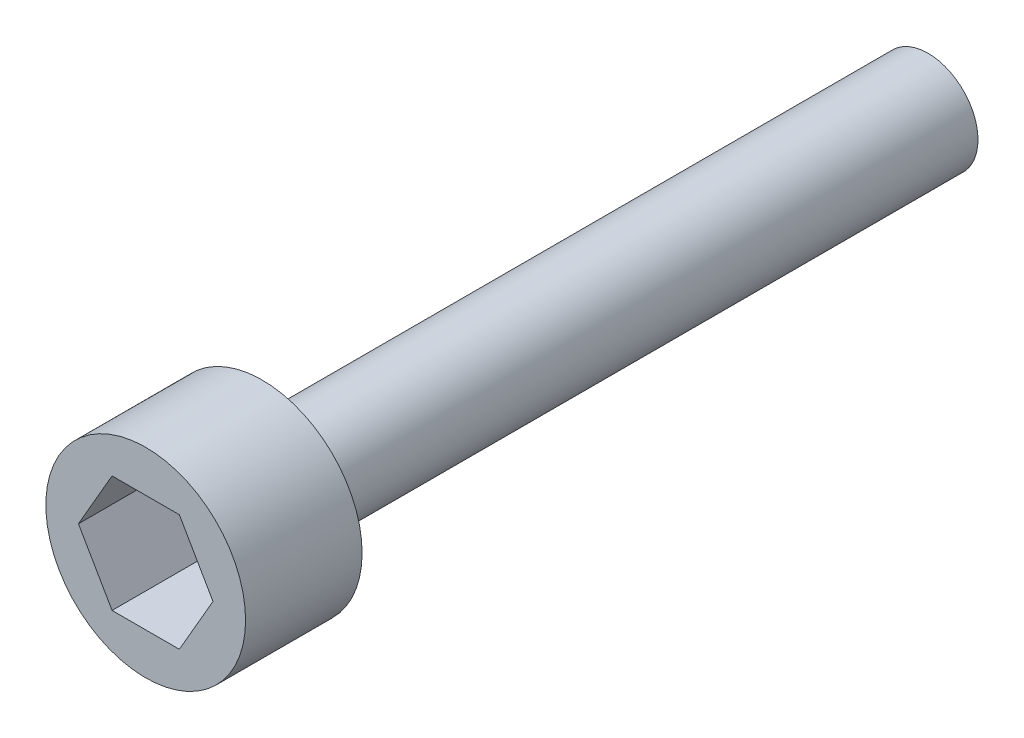
ISO-10303-21;
HEADER;
FILE_DESCRIPTION(('STEP AP214'),'2;1');
FILE_NAME('part.step','',(''),(''),'','','');
FILE_SCHEMA(('AUTOMOTIVE_DESIGN { 1 0 10303 214 1 1 1 1 }'));
ENDSEC;
DATA;
#1=APPLICATION_CONTEXT('core data for automotive mechanical design processes');
#2=APPLICATION_PROTOCOL_DEFINITION('international standard','automotive_design',2000,#1);
#3=PRODUCT_CONTEXT('',#1,'mechanical');
#4=PRODUCT('Part','Part','',(#3));
#5=PRODUCT_RELATED_PRODUCT_CATEGORY('part','',(#4));
#6=PRODUCT_DEFINITION_FORMATION('','',#4);
#7=PRODUCT_DEFINITION_CONTEXT('part definition',#1,'design');
#8=PRODUCT_DEFINITION('design','',#6,#7);
#9=PRODUCT_DEFINITION_SHAPE('','',#8);
#10=(LENGTH_UNIT() NAMED_UNIT(*) SI_UNIT(.MILLI.,.METRE.));
#11=(NAMED_UNIT(*) PLANE_ANGLE_UNIT() SI_UNIT($,.RADIAN.));
#12=(NAMED_UNIT(*) SI_UNIT($,.STERADIAN.) SOLID_ANGLE_UNIT());
#13=UNCERTAINTY_MEASURE_WITH_UNIT(LENGTH_MEASURE(1.E-05),#10,'distance_accuracy_value','');
#14=(GEOMETRIC_REPRESENTATION_CONTEXT(3) GLOBAL_UNCERTAINTY_ASSIGNED_CONTEXT((#13)) GLOBAL_UNIT_ASSIGNED_CONTEXT((#10,
#11,#12)) REPRESENTATION_CONTEXT('',''));
#15=CARTESIAN_POINT('',(0.,0.,0.));
#16=DIRECTION('',(0.,0.,1.));
#17=DIRECTION('',(1.,0.,0.));
#18=AXIS2_PLACEMENT_3D('',#15,#16,#17);
#19=CARTESIAN_POINT('',(0.,0.,3.5));
#20=DIRECTION('',(0.,0.,-1.));
#21=DIRECTION('',(-1.,0.,0.));
#22=AXIS2_PLACEMENT_3D('',#19,#20,#21);
#23=CYLINDRICAL_SURFACE('',#22,3.);
#24=CARTESIAN_POINT('',(0.,0.,3.5));
#25=DIRECTION('',(0.,0.,1.));
#26=DIRECTION('',(1.,0.,0.));
#27=AXIS2_PLACEMENT_3D('',#24,#25,#26);
#28=CIRCLE('',#27,3.);
#29=CARTESIAN_POINT('',(3.,0.,3.5));
#30=VERTEX_POINT('',#29);
#31=EDGE_CURVE('E11',#30,#30,#28,.T.);
#32=ORIENTED_EDGE('',*,*,#31,.F.);
#33=EDGE_LOOP('',(#32));
#34=FACE_BOUND('',#33,.T.);
#35=CARTESIAN_POINT('',(0.,0.,0.));
#36=DIRECTION('',(0.,0.,1.));
#37=DIRECTION('',(1.,0.,0.));
#38=AXIS2_PLACEMENT_3D('',#35,#36,#37);
#39=CIRCLE('',#38,3.);
#40=CARTESIAN_POINT('',(3.,0.,0.));
#41=VERTEX_POINT('',#40);
#42=EDGE_CURVE('E38',#41,#41,#39,.T.);
#43=ORIENTED_EDGE('',*,*,#42,.T.);
#44=EDGE_LOOP('',(#43));
#45=FACE_BOUND('',#44,.T.);
#46=ADVANCED_FACE('F35',(#34,#45),#23,.T.);
#47=CARTESIAN_POINT('',(0.,0.,3.5));
#48=DIRECTION('',(0.,0.,1.));
#49=DIRECTION('',(1.,0.,0.));
#50=AXIS2_PLACEMENT_3D('',#47,#48,#49);
#51=PLANE('',#50);
#52=DIRECTION('',(-0.499999999999528,-0.866025403784711,0.));
#53=VECTOR('',#52,1.);
#54=CARTESIAN_POINT('',(-2.02072594216261,2.1557411053031E-12,3.5));
#55=LINE('',#54,#53);
#56=CARTESIAN_POINT('',(-1.01036297108294,1.75000000000058,3.5));
#57=VERTEX_POINT('',#56);
#58=CARTESIAN_POINT('',(-2.02072594216261,2.15561075933568E-12,3.5));
#59=VERTEX_POINT('',#58);
#60=EDGE_CURVE('E49',#57,#59,#55,.T.);
#61=ORIENTED_EDGE('',*,*,#60,.F.);
#62=DIRECTION('',(-1.,-7.11024037944377E-13,0.));
#63=VECTOR('',#62,1.);
#64=CARTESIAN_POINT('',(-1.01036297108294,1.75000000000058,3.5));
#65=LINE('',#64,#63);
#66=CARTESIAN_POINT('',(1.01036297108301,1.75000000000202,3.5));
#67=VERTEX_POINT('',#66);
#68=EDGE_CURVE('E133',#67,#57,#65,.T.);
#69=ORIENTED_EDGE('',*,*,#68,.F.);
#70=DIRECTION('',(-0.50000000000043,0.86602540378419,0.));
#71=VECTOR('',#70,1.);
#72=CARTESIAN_POINT('',(1.01036297108301,1.75000000000202,3.5));
#73=LINE('',#72,#71);
#74=CARTESIAN_POINT('',(2.02072594216593,2.15574110530311E-12,3.5));
#75=VERTEX_POINT('',#74);
#76=EDGE_CURVE('E131',#75,#67,#73,.T.);
#77=ORIENTED_EDGE('',*,*,#76,.F.);
#78=DIRECTION('',(0.499999999999527,0.866025403784711,0.));
#79=VECTOR('',#78,1.);
#80=CARTESIAN_POINT('',(2.02072594216593,2.15574110530311E-12,3.5));
#81=LINE('',#80,#79);
#82=CARTESIAN_POINT('',(1.01036297108301,-1.75000000000192,3.5));
#83=VERTEX_POINT('',#82);
#84=EDGE_CURVE('E97',#83,#75,#81,.T.);
#85=ORIENTED_EDGE('',*,*,#84,.F.);
#86=DIRECTION('',(1.,7.11024037946673E-13,0.));
#87=VECTOR('',#86,1.);
#88=CARTESIAN_POINT('',(1.01036297108301,-1.75000000000192,3.5));
#89=LINE('',#88,#87);
#90=CARTESIAN_POINT('',(-1.01036297107642,-1.75000000000336,3.5));
#91=VERTEX_POINT('',#90);
#92=EDGE_CURVE('E127',#91,#83,#89,.T.);
#93=ORIENTED_EDGE('',*,*,#92,.F.);
#94=DIRECTION('',(0.500000000000431,-0.86602540378419,0.));
#95=VECTOR('',#94,1.);
#96=CARTESIAN_POINT('',(-1.01036297107642,-1.75000000000336,3.5));
#97=LINE('',#96,#95);
#98=EDGE_CURVE('E123',#59,#91,#97,.T.);
#99=ORIENTED_EDGE('',*,*,#98,.F.);
#100=EDGE_LOOP('',(#61,#69,#77,#85,#93,#99));
#101=FACE_BOUND('',#100,.T.);
#102=ORIENTED_EDGE('',*,*,#31,.T.);
#103=EDGE_LOOP('',(#102));
#104=FACE_BOUND('',#103,.T.);
#105=ADVANCED_FACE('F146',(#101,#104),#51,.T.);
#106=CARTESIAN_POINT('',(0.,0.,0.));
#107=DIRECTION('',(0.,0.,1.));
#108=DIRECTION('',(1.,0.,0.));
#109=AXIS2_PLACEMENT_3D('',#106,#107,#108);
#110=PLANE('',#109);
#111=CARTESIAN_POINT('',(0.,0.,0.));
#112=DIRECTION('',(0.,0.,1.));
#113=DIRECTION('',(1.,0.,0.));
#114=AXIS2_PLACEMENT_3D('',#111,#112,#113);
#115=CIRCLE('',#114,1.5);
#116=CARTESIAN_POINT('',(1.5,0.,0.));
#117=VERTEX_POINT('',#116);
#118=EDGE_CURVE('E153',#117,#117,#115,.T.);
#119=ORIENTED_EDGE('',*,*,#118,.T.);
#120=EDGE_LOOP('',(#119));
#121=FACE_BOUND('',#120,.T.);
#122=ORIENTED_EDGE('',*,*,#42,.F.);
#123=EDGE_LOOP('',(#122));
#124=FACE_BOUND('',#123,.T.);
#125=ADVANCED_FACE('F174',(#121,#124),#110,.F.);
#126=CARTESIAN_POINT('',(-2.02072594216261,2.1557411053031E-12,0.7));
#127=DIRECTION('',(-0.866025403784711,0.499999999999528,0.));
#128=DIRECTION('',(-0.499999999999528,-0.866025403784711,0.));
#129=AXIS2_PLACEMENT_3D('',#126,#127,#128);
#130=PLANE('',#129);
#131=ORIENTED_EDGE('',*,*,#60,.T.);
#132=DIRECTION('',(0.,0.,1.));
#133=VECTOR('',#132,1.);
#134=CARTESIAN_POINT('',(-2.02072594216261,2.1557411053031E-12,0.7));
#135=LINE('',#134,#133);
#136=CARTESIAN_POINT('',(-2.02072594216261,2.1557411053031E-12,0.7));
#137=VERTEX_POINT('',#136);
#138=EDGE_CURVE('E79',#137,#59,#135,.T.);
#139=ORIENTED_EDGE('',*,*,#138,.F.);
#140=DIRECTION('',(-0.499999999999528,-0.866025403784711,0.));
#141=VECTOR('',#140,1.);
#142=CARTESIAN_POINT('',(-2.02072594216261,2.1557411053031E-12,0.7));
#143=LINE('',#142,#141);
#144=CARTESIAN_POINT('',(-1.01036297108294,1.75000000000058,0.7));
#145=VERTEX_POINT('',#144);
#146=EDGE_CURVE('E135',#145,#137,#143,.T.);
#147=ORIENTED_EDGE('',*,*,#146,.F.);
#148=DIRECTION('',(0.,0.,1.));
#149=VECTOR('',#148,1.);
#150=CARTESIAN_POINT('',(-1.01036297108294,1.75000000000058,0.7));
#151=LINE('',#150,#149);
#152=EDGE_CURVE('E57',#145,#57,#151,.T.);
#153=ORIENTED_EDGE('',*,*,#152,.T.);
#154=EDGE_LOOP('',(#131,#139,#147,#153));
#155=FACE_BOUND('',#154,.T.);
#156=ADVANCED_FACE('F182',(#155),#130,.F.);
#157=CARTESIAN_POINT('',(-1.01036297108294,1.75000000000058,0.7));
#158=DIRECTION('',(-7.11024037944377E-13,1.,0.));
#159=DIRECTION('',(-1.,-7.11024037944377E-13,0.));
#160=AXIS2_PLACEMENT_3D('',#157,#158,#159);
#161=PLANE('',#160);
#162=ORIENTED_EDGE('',*,*,#68,.T.);
#163=ORIENTED_EDGE('',*,*,#152,.F.);
#164=DIRECTION('',(-1.,-7.11024037944377E-13,0.));
#165=VECTOR('',#164,1.);
#166=CARTESIAN_POINT('',(-1.01036297108294,1.75000000000058,0.7));
#167=LINE('',#166,#165);
#168=CARTESIAN_POINT('',(1.01036297108301,1.75000000000202,0.7));
#169=VERTEX_POINT('',#168);
#170=EDGE_CURVE('E109',#169,#145,#167,.T.);
#171=ORIENTED_EDGE('',*,*,#170,.F.);
#172=DIRECTION('',(0.,0.,1.));
#173=VECTOR('',#172,1.);
#174=CARTESIAN_POINT('',(1.01036297108301,1.75000000000202,0.7));
#175=LINE('',#174,#173);
#176=EDGE_CURVE('E101',#169,#67,#175,.T.);
#177=ORIENTED_EDGE('',*,*,#176,.T.);
#178=EDGE_LOOP('',(#162,#163,#171,#177));
#179=FACE_BOUND('',#178,.T.);
#180=ADVANCED_FACE('F187',(#179),#161,.F.);
#181=CARTESIAN_POINT('',(1.01036297108301,1.75000000000202,0.7));
#182=DIRECTION('',(0.86602540378419,0.50000000000043,0.));
#183=DIRECTION('',(-0.50000000000043,0.86602540378419,0.));
#184=AXIS2_PLACEMENT_3D('',#181,#182,#183);
#185=PLANE('',#184);
#186=ORIENTED_EDGE('',*,*,#76,.T.);
#187=ORIENTED_EDGE('',*,*,#176,.F.);
#188=DIRECTION('',(-0.50000000000043,0.86602540378419,0.));
#189=VECTOR('',#188,1.);
#190=CARTESIAN_POINT('',(1.01036297108301,1.75000000000202,0.7));
#191=LINE('',#190,#189);
#192=CARTESIAN_POINT('',(2.02072594216593,2.15574110530311E-12,0.7));
#193=VERTEX_POINT('',#192);
#194=EDGE_CURVE('E105',#193,#169,#191,.T.);
#195=ORIENTED_EDGE('',*,*,#194,.F.);
#196=DIRECTION('',(0.,0.,1.));
#197=VECTOR('',#196,1.);
#198=CARTESIAN_POINT('',(2.02072594216593,2.15574110530311E-12,0.7));
#199=LINE('',#198,#197);
#200=EDGE_CURVE('E90',#193,#75,#199,.T.);
#201=ORIENTED_EDGE('',*,*,#200,.T.);
#202=EDGE_LOOP('',(#186,#187,#195,#201));
#203=FACE_BOUND('',#202,.T.);
#204=ADVANCED_FACE('F106',(#203),#185,.F.);
#205=CARTESIAN_POINT('',(2.02072594216593,2.15574110530311E-12,0.7));
#206=DIRECTION('',(0.866025403784712,-0.499999999999527,0.));
#207=DIRECTION('',(0.499999999999527,0.866025403784712,0.));
#208=AXIS2_PLACEMENT_3D('',#205,#206,#207);
#209=PLANE('',#208);
#210=ORIENTED_EDGE('',*,*,#84,.T.);
#211=ORIENTED_EDGE('',*,*,#200,.F.);
#212=DIRECTION('',(0.499999999999527,0.866025403784711,0.));
#213=VECTOR('',#212,1.);
#214=CARTESIAN_POINT('',(2.02072594216593,2.15574110530311E-12,0.7));
#215=LINE('',#214,#213);
#216=CARTESIAN_POINT('',(1.01036297108301,-1.75000000000192,0.7));
#217=VERTEX_POINT('',#216);
#218=EDGE_CURVE('E94',#217,#193,#215,.T.);
#219=ORIENTED_EDGE('',*,*,#218,.F.);
#220=DIRECTION('',(0.,0.,1.));
#221=VECTOR('',#220,1.);
#222=CARTESIAN_POINT('',(1.01036297108301,-1.75000000000192,0.7));
#223=LINE('',#222,#221);
#224=EDGE_CURVE('E102',#217,#83,#223,.T.);
#225=ORIENTED_EDGE('',*,*,#224,.T.);
#226=EDGE_LOOP('',(#210,#211,#219,#225));
#227=FACE_BOUND('',#226,.T.);
#228=ADVANCED_FACE('F92',(#227),#209,.F.);
#229=CARTESIAN_POINT('',(1.01036297108301,-1.75000000000192,0.7));
#230=DIRECTION('',(7.11024037946673E-13,-1.,0.));
#231=DIRECTION('',(1.,7.11024037946673E-13,0.));
#232=AXIS2_PLACEMENT_3D('',#229,#230,#231);
#233=PLANE('',#232);
#234=ORIENTED_EDGE('',*,*,#92,.T.);
#235=ORIENTED_EDGE('',*,*,#224,.F.);
#236=DIRECTION('',(1.,7.11024037946673E-13,0.));
#237=VECTOR('',#236,1.);
#238=CARTESIAN_POINT('',(1.01036297108301,-1.75000000000192,0.7));
#239=LINE('',#238,#237);
#240=CARTESIAN_POINT('',(-1.01036297107642,-1.75000000000336,0.7));
#241=VERTEX_POINT('',#240);
#242=EDGE_CURVE('E115',#241,#217,#239,.T.);
#243=ORIENTED_EDGE('',*,*,#242,.F.);
#244=DIRECTION('',(0.,0.,1.));
#245=VECTOR('',#244,1.);
#246=CARTESIAN_POINT('',(-1.01036297107642,-1.75000000000336,0.7));
#247=LINE('',#246,#245);
#248=EDGE_CURVE('E139',#241,#91,#247,.T.);
#249=ORIENTED_EDGE('',*,*,#248,.T.);
#250=EDGE_LOOP('',(#234,#235,#243,#249));
#251=FACE_BOUND('',#250,.T.);
#252=ADVANCED_FACE('F150',(#251),#233,.F.);
#253=CARTESIAN_POINT('',(-1.01036297107642,-1.75000000000336,0.7));
#254=DIRECTION('',(-0.86602540378419,-0.500000000000431,0.));
#255=DIRECTION('',(0.500000000000431,-0.86602540378419,0.));
#256=AXIS2_PLACEMENT_3D('',#253,#254,#255);
#257=PLANE('',#256);
#258=ORIENTED_EDGE('',*,*,#98,.T.);
#259=ORIENTED_EDGE('',*,*,#248,.F.);
#260=DIRECTION('',(0.500000000000431,-0.86602540378419,0.));
#261=VECTOR('',#260,1.);
#262=CARTESIAN_POINT('',(-1.01036297107642,-1.75000000000336,0.7));
#263=LINE('',#262,#261);
#264=EDGE_CURVE('E117',#137,#241,#263,.T.);
#265=ORIENTED_EDGE('',*,*,#264,.F.);
#266=ORIENTED_EDGE('',*,*,#138,.T.);
#267=EDGE_LOOP('',(#258,#259,#265,#266));
#268=FACE_BOUND('',#267,.T.);
#269=ADVANCED_FACE('F143',(#268),#257,.F.);
#270=CARTESIAN_POINT('',(-1.01036297108294,1.75000000000058,0.7));
#271=DIRECTION('',(0.,0.,-1.));
#272=DIRECTION('',(-1.,0.,0.));
#273=AXIS2_PLACEMENT_3D('',#270,#271,#272);
#274=PLANE('',#273);
#275=ORIENTED_EDGE('',*,*,#146,.T.);
#276=ORIENTED_EDGE('',*,*,#264,.T.);
#277=ORIENTED_EDGE('',*,*,#242,.T.);
#278=ORIENTED_EDGE('',*,*,#218,.T.);
#279=ORIENTED_EDGE('',*,*,#194,.T.);
#280=ORIENTED_EDGE('',*,*,#170,.T.);
#281=EDGE_LOOP('',(#275,#276,#277,#278,#279,#280));
#282=FACE_BOUND('',#281,.T.);
#283=ADVANCED_FACE('F112',(#282),#274,.F.);
#284=CARTESIAN_POINT('',(0.,0.,-20.));
#285=DIRECTION('',(0.,0.,1.));
#286=DIRECTION('',(1.,0.,0.));
#287=AXIS2_PLACEMENT_3D('',#284,#285,#286);
#288=CYLINDRICAL_SURFACE('',#287,1.5);
#289=CARTESIAN_POINT('',(0.,0.,-20.));
#290=DIRECTION('',(0.,0.,1.));
#291=DIRECTION('',(1.,0.,0.));
#292=AXIS2_PLACEMENT_3D('',#289,#290,#291);
#293=CIRCLE('',#292,1.5);
#294=CARTESIAN_POINT('',(1.5,0.,-20.));
#295=VERTEX_POINT('',#294);
#296=EDGE_CURVE('E124',#295,#295,#293,.T.);
#297=ORIENTED_EDGE('',*,*,#296,.T.);
#298=EDGE_LOOP('',(#297));
#299=FACE_BOUND('',#298,.T.);
#300=ORIENTED_EDGE('',*,*,#118,.F.);
#301=EDGE_LOOP('',(#300));
#302=FACE_BOUND('',#301,.T.);
#303=ADVANCED_FACE('F159',(#299,#302),#288,.T.);
#304=CARTESIAN_POINT('',(0.,0.,-20.));
#305=DIRECTION('',(0.,0.,1.));
#306=DIRECTION('',(1.,0.,0.));
#307=AXIS2_PLACEMENT_3D('',#304,#305,#306);
#308=PLANE('',#307);
#309=ORIENTED_EDGE('',*,*,#296,.F.);
#310=EDGE_LOOP('',(#309));
#311=FACE_BOUND('',#310,.T.);
#312=ADVANCED_FACE('F162',(#311),#308,.F.);
#313=CLOSED_SHELL('',(#46,#105,#125,#156,#180,#204,#228,#252,#269,#283,#303,#312));
#314=MANIFOLD_SOLID_BREP('B2',#313);
#315=ADVANCED_BREP_SHAPE_REPRESENTATION('',(#18,#314),#14);
#316=SHAPE_DEFINITION_REPRESENTATION(#9,#315);
ENDSEC;
END-ISO-10303-21;
